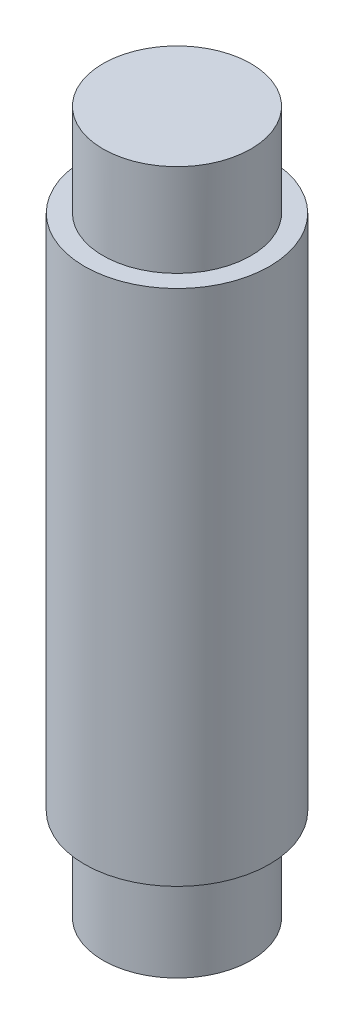
ISO-10303-21;
HEADER;
FILE_DESCRIPTION(('STEP AP214'),'2;1');
FILE_NAME('part.step','',(''),(''),'','','');
FILE_SCHEMA(('AUTOMOTIVE_DESIGN { 1 0 10303 214 1 1 1 1 }'));
ENDSEC;
DATA;
#1=APPLICATION_CONTEXT('core data for automotive mechanical design processes');
#2=APPLICATION_PROTOCOL_DEFINITION('international standard','automotive_design',2000,#1);
#3=PRODUCT_CONTEXT('',#1,'mechanical');
#4=PRODUCT('Part','Part','',(#3));
#5=PRODUCT_RELATED_PRODUCT_CATEGORY('part','',(#4));
#6=PRODUCT_DEFINITION_FORMATION('','',#4);
#7=PRODUCT_DEFINITION_CONTEXT('part definition',#1,'design');
#8=PRODUCT_DEFINITION('design','',#6,#7);
#9=PRODUCT_DEFINITION_SHAPE('','',#8);
#10=(LENGTH_UNIT() NAMED_UNIT(*) SI_UNIT(.MILLI.,.METRE.));
#11=(NAMED_UNIT(*) PLANE_ANGLE_UNIT() SI_UNIT($,.RADIAN.));
#12=(NAMED_UNIT(*) SI_UNIT($,.STERADIAN.) SOLID_ANGLE_UNIT());
#13=UNCERTAINTY_MEASURE_WITH_UNIT(LENGTH_MEASURE(1.E-05),#10,'distance_accuracy_value','');
#14=(GEOMETRIC_REPRESENTATION_CONTEXT(3) GLOBAL_UNCERTAINTY_ASSIGNED_CONTEXT((#13)) GLOBAL_UNIT_ASSIGNED_CONTEXT((#10,
#11,#12)) REPRESENTATION_CONTEXT('',''));
#15=CARTESIAN_POINT('',(0.,0.,0.));
#16=DIRECTION('',(0.,0.,1.));
#17=DIRECTION('',(1.,0.,0.));
#18=AXIS2_PLACEMENT_3D('',#15,#16,#17);
#19=CARTESIAN_POINT('',(0.,0.,0.));
#20=DIRECTION('',(0.,-1.,0.));
#21=DIRECTION('',(0.,0.,-1.));
#22=AXIS2_PLACEMENT_3D('',#19,#20,#21);
#23=CYLINDRICAL_SURFACE('',#22,2.5);
#24=CARTESIAN_POINT('',(0.,14.,0.));
#25=DIRECTION('',(0.,-1.,0.));
#26=DIRECTION('',(0.,0.,-1.));
#27=AXIS2_PLACEMENT_3D('',#24,#25,#26);
#28=CIRCLE('',#27,2.5);
#29=CARTESIAN_POINT('',(0.,14.,-2.5));
#30=VERTEX_POINT('',#29);
#31=EDGE_CURVE('E49',#30,#30,#28,.T.);
#32=ORIENTED_EDGE('',*,*,#31,.T.);
#33=EDGE_LOOP('',(#32));
#34=FACE_BOUND('',#33,.T.);
#35=CARTESIAN_POINT('',(0.,0.,0.));
#36=DIRECTION('',(0.,-1.,0.));
#37=DIRECTION('',(0.,0.,-1.));
#38=AXIS2_PLACEMENT_3D('',#35,#36,#37);
#39=CIRCLE('',#38,2.5);
#40=CARTESIAN_POINT('',(0.,0.,-2.5));
#41=VERTEX_POINT('',#40);
#42=EDGE_CURVE('E45',#41,#41,#39,.T.);
#43=ORIENTED_EDGE('',*,*,#42,.F.);
#44=EDGE_LOOP('',(#43));
#45=FACE_BOUND('',#44,.T.);
#46=ADVANCED_FACE('F35',(#34,#45),#23,.T.);
#47=CARTESIAN_POINT('',(2.5,0.,0.));
#48=DIRECTION('',(0.,1.,0.));
#49=DIRECTION('',(0.,0.,1.));
#50=AXIS2_PLACEMENT_3D('',#47,#48,#49);
#51=PLANE('',#50);
#52=CARTESIAN_POINT('',(0.,0.,0.));
#53=DIRECTION('',(0.,1.,0.));
#54=DIRECTION('',(0.,0.,1.));
#55=AXIS2_PLACEMENT_3D('',#52,#53,#54);
#56=CIRCLE('',#55,2.);
#57=CARTESIAN_POINT('',(0.,0.,2.));
#58=VERTEX_POINT('',#57);
#59=EDGE_CURVE('E10',#58,#58,#56,.F.);
#60=ORIENTED_EDGE('',*,*,#59,.F.);
#61=EDGE_LOOP('',(#60));
#62=FACE_BOUND('',#61,.T.);
#63=ORIENTED_EDGE('',*,*,#42,.T.);
#64=EDGE_LOOP('',(#63));
#65=FACE_BOUND('',#64,.T.);
#66=ADVANCED_FACE('F76',(#62,#65),#51,.F.);
#67=CARTESIAN_POINT('',(0.,14.,0.));
#68=DIRECTION('',(0.,-1.,0.));
#69=DIRECTION('',(0.,0.,-1.));
#70=AXIS2_PLACEMENT_3D('',#67,#68,#69);
#71=PLANE('',#70);
#72=CARTESIAN_POINT('',(0.,14.,0.));
#73=DIRECTION('',(0.,-1.,0.));
#74=DIRECTION('',(0.,0.,-1.));
#75=AXIS2_PLACEMENT_3D('',#72,#73,#74);
#76=CIRCLE('',#75,2.);
#77=CARTESIAN_POINT('',(0.,14.,-2.));
#78=VERTEX_POINT('',#77);
#79=EDGE_CURVE('E41',#78,#78,#76,.F.);
#80=ORIENTED_EDGE('',*,*,#79,.F.);
#81=EDGE_LOOP('',(#80));
#82=FACE_BOUND('',#81,.T.);
#83=ORIENTED_EDGE('',*,*,#31,.F.);
#84=EDGE_LOOP('',(#83));
#85=FACE_BOUND('',#84,.T.);
#86=ADVANCED_FACE('F81',(#82,#85),#71,.F.);
#87=CARTESIAN_POINT('',(0.,16.5,0.));
#88=DIRECTION('',(0.,-1.,0.));
#89=DIRECTION('',(0.,0.,-1.));
#90=AXIS2_PLACEMENT_3D('',#87,#88,#89);
#91=CYLINDRICAL_SURFACE('',#90,2.);
#92=CARTESIAN_POINT('',(0.,16.5,0.));
#93=DIRECTION('',(0.,1.,0.));
#94=DIRECTION('',(0.,0.,1.));
#95=AXIS2_PLACEMENT_3D('',#92,#93,#94);
#96=CIRCLE('',#95,2.);
#97=CARTESIAN_POINT('',(0.,16.5,2.));
#98=VERTEX_POINT('',#97);
#99=EDGE_CURVE('E54',#98,#98,#96,.T.);
#100=ORIENTED_EDGE('',*,*,#99,.F.);
#101=EDGE_LOOP('',(#100));
#102=FACE_BOUND('',#101,.T.);
#103=ORIENTED_EDGE('',*,*,#79,.T.);
#104=EDGE_LOOP('',(#103));
#105=FACE_BOUND('',#104,.T.);
#106=ADVANCED_FACE('F72',(#102,#105),#91,.T.);
#107=CARTESIAN_POINT('',(0.,16.5,0.));
#108=DIRECTION('',(0.,1.,0.));
#109=DIRECTION('',(0.,0.,1.));
#110=AXIS2_PLACEMENT_3D('',#107,#108,#109);
#111=PLANE('',#110);
#112=ORIENTED_EDGE('',*,*,#99,.T.);
#113=EDGE_LOOP('',(#112));
#114=FACE_BOUND('',#113,.T.);
#115=ADVANCED_FACE('F65',(#114),#111,.T.);
#116=CARTESIAN_POINT('',(0.,-2.5,0.));
#117=DIRECTION('',(0.,1.,0.));
#118=DIRECTION('',(0.,0.,1.));
#119=AXIS2_PLACEMENT_3D('',#116,#117,#118);
#120=CYLINDRICAL_SURFACE('',#119,2.);
#121=CARTESIAN_POINT('',(0.,-2.5,0.));
#122=DIRECTION('',(0.,-1.,0.));
#123=DIRECTION('',(0.,0.,-1.));
#124=AXIS2_PLACEMENT_3D('',#121,#122,#123);
#125=CIRCLE('',#124,2.);
#126=CARTESIAN_POINT('',(0.,-2.5,-2.));
#127=VERTEX_POINT('',#126);
#128=EDGE_CURVE('E57',#127,#127,#125,.T.);
#129=ORIENTED_EDGE('',*,*,#128,.F.);
#130=EDGE_LOOP('',(#129));
#131=FACE_BOUND('',#130,.T.);
#132=ORIENTED_EDGE('',*,*,#59,.T.);
#133=EDGE_LOOP('',(#132));
#134=FACE_BOUND('',#133,.T.);
#135=ADVANCED_FACE('F63',(#131,#134),#120,.T.);
#136=CARTESIAN_POINT('',(0.,-2.5,0.));
#137=DIRECTION('',(0.,-1.,0.));
#138=DIRECTION('',(0.,0.,-1.));
#139=AXIS2_PLACEMENT_3D('',#136,#137,#138);
#140=PLANE('',#139);
#141=ORIENTED_EDGE('',*,*,#128,.T.);
#142=EDGE_LOOP('',(#141));
#143=FACE_BOUND('',#142,.T.);
#144=ADVANCED_FACE('F61',(#143),#140,.T.);
#145=CLOSED_SHELL('',(#46,#66,#86,#106,#115,#135,#144));
#146=MANIFOLD_SOLID_BREP('B2',#145);
#147=ADVANCED_BREP_SHAPE_REPRESENTATION('',(#18,#146),#14);
#148=SHAPE_DEFINITION_REPRESENTATION(#9,#147);
ENDSEC;
END-ISO-10303-21;
